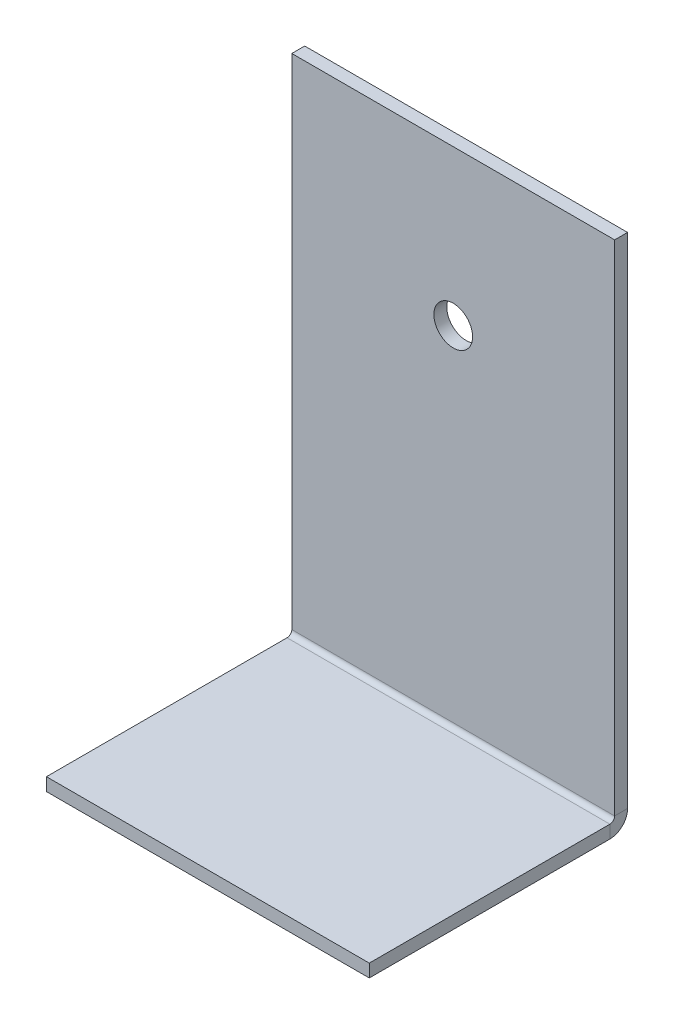
ISO-10303-21;
HEADER;
FILE_DESCRIPTION(('STEP AP214'),'2;1');
FILE_NAME('part.step','',(''),(''),'','','');
FILE_SCHEMA(('AUTOMOTIVE_DESIGN { 1 0 10303 214 1 1 1 1 }'));
ENDSEC;
DATA;
#1=APPLICATION_CONTEXT('core data for automotive mechanical design processes');
#2=APPLICATION_PROTOCOL_DEFINITION('international standard','automotive_design',2000,#1);
#3=PRODUCT_CONTEXT('',#1,'mechanical');
#4=PRODUCT('Part','Part','',(#3));
#5=PRODUCT_RELATED_PRODUCT_CATEGORY('part','',(#4));
#6=PRODUCT_DEFINITION_FORMATION('','',#4);
#7=PRODUCT_DEFINITION_CONTEXT('part definition',#1,'design');
#8=PRODUCT_DEFINITION('design','',#6,#7);
#9=PRODUCT_DEFINITION_SHAPE('','',#8);
#10=(LENGTH_UNIT() NAMED_UNIT(*) SI_UNIT(.MILLI.,.METRE.));
#11=(NAMED_UNIT(*) PLANE_ANGLE_UNIT() SI_UNIT($,.RADIAN.));
#12=(NAMED_UNIT(*) SI_UNIT($,.STERADIAN.) SOLID_ANGLE_UNIT());
#13=UNCERTAINTY_MEASURE_WITH_UNIT(LENGTH_MEASURE(1.E-05),#10,'distance_accuracy_value','');
#14=(GEOMETRIC_REPRESENTATION_CONTEXT(3) GLOBAL_UNCERTAINTY_ASSIGNED_CONTEXT((#13)) GLOBAL_UNIT_ASSIGNED_CONTEXT((#10,
#11,#12)) REPRESENTATION_CONTEXT('',''));
#15=CARTESIAN_POINT('',(0.,0.,0.));
#16=DIRECTION('',(0.,0.,1.));
#17=DIRECTION('',(1.,0.,0.));
#18=AXIS2_PLACEMENT_3D('',#15,#16,#17);
#19=CARTESIAN_POINT('',(-28.5511363636364,-2.,-17.6846590909091));
#20=DIRECTION('',(-1.,0.,0.));
#21=DIRECTION('',(0.,0.,1.));
#22=AXIS2_PLACEMENT_3D('',#19,#20,#21);
#23=PLANE('',#22);
#24=DIRECTION('',(0.,0.,1.));
#25=VECTOR('',#24,1.);
#26=CARTESIAN_POINT('',(-28.5511363636364,0.,-17.6846590909091));
#27=LINE('',#26,#25);
#28=CARTESIAN_POINT('',(-28.5511363636364,0.,-14.9480590909091));
#29=VERTEX_POINT('',#28);
#30=CARTESIAN_POINT('',(-28.5511363636364,0.,22.3153409090909));
#31=VERTEX_POINT('',#30);
#32=EDGE_CURVE('E105',#29,#31,#27,.T.);
#33=ORIENTED_EDGE('',*,*,#32,.F.);
#34=DIRECTION('',(0.,-1.,0.));
#35=VECTOR('',#34,1.);
#36=CARTESIAN_POINT('',(-28.5511363636364,0.,-14.9480590909091));
#37=LINE('',#36,#35);
#38=CARTESIAN_POINT('',(-28.5511363636364,-2.00000000000001,-14.9480590909091));
#39=VERTEX_POINT('',#38);
#40=EDGE_CURVE('E114',#29,#39,#37,.T.);
#41=ORIENTED_EDGE('',*,*,#40,.T.);
#42=DIRECTION('',(0.,0.,1.));
#43=VECTOR('',#42,1.);
#44=CARTESIAN_POINT('',(-28.5511363636364,-2.,-17.6846590909091));
#45=LINE('',#44,#43);
#46=CARTESIAN_POINT('',(-28.5511363636364,-2.,22.3153409090909));
#47=VERTEX_POINT('',#46);
#48=EDGE_CURVE('E102',#39,#47,#45,.T.);
#49=ORIENTED_EDGE('',*,*,#48,.T.);
#50=DIRECTION('',(0.,1.,0.));
#51=VECTOR('',#50,1.);
#52=CARTESIAN_POINT('',(-28.5511363636364,-2.,22.3153409090909));
#53=LINE('',#52,#51);
#54=EDGE_CURVE('E60',#47,#31,#53,.T.);
#55=ORIENTED_EDGE('',*,*,#54,.T.);
#56=EDGE_LOOP('',(#33,#41,#49,#55));
#57=FACE_BOUND('',#56,.T.);
#58=ADVANCED_FACE('F57',(#57),#23,.T.);
#59=CARTESIAN_POINT('',(0.,-2.,0.));
#60=DIRECTION('',(0.,1.,0.));
#61=DIRECTION('',(0.,0.,1.));
#62=AXIS2_PLACEMENT_3D('',#59,#60,#61);
#63=PLANE('',#62);
#64=DIRECTION('',(-1.,0.,0.));
#65=VECTOR('',#64,1.);
#66=CARTESIAN_POINT('',(-28.5511363636364,-2.00000000000001,-14.9480590909091));
#67=LINE('',#66,#65);
#68=CARTESIAN_POINT('',(21.4488636363636,-2.,-14.9480590909091));
#69=VERTEX_POINT('',#68);
#70=EDGE_CURVE('E130',#39,#69,#67,.F.);
#71=ORIENTED_EDGE('',*,*,#70,.T.);
#72=DIRECTION('',(0.,0.,-1.));
#73=VECTOR('',#72,1.);
#74=CARTESIAN_POINT('',(21.4488636363636,-2.,-17.6846590909091));
#75=LINE('',#74,#73);
#76=CARTESIAN_POINT('',(21.4488636363636,-2.,22.3153409090909));
#77=VERTEX_POINT('',#76);
#78=EDGE_CURVE('E110',#77,#69,#75,.T.);
#79=ORIENTED_EDGE('',*,*,#78,.F.);
#80=DIRECTION('',(1.,0.,0.));
#81=VECTOR('',#80,1.);
#82=CARTESIAN_POINT('',(-28.5511363636364,-2.,22.3153409090909));
#83=LINE('',#82,#81);
#84=EDGE_CURVE('E95',#47,#77,#83,.T.);
#85=ORIENTED_EDGE('',*,*,#84,.F.);
#86=ORIENTED_EDGE('',*,*,#48,.F.);
#87=EDGE_LOOP('',(#71,#79,#85,#86));
#88=FACE_BOUND('',#87,.T.);
#89=ADVANCED_FACE('F229',(#88),#63,.F.);
#90=CARTESIAN_POINT('',(0.,0.,0.));
#91=DIRECTION('',(0.,1.,0.));
#92=DIRECTION('',(0.,0.,1.));
#93=AXIS2_PLACEMENT_3D('',#90,#91,#92);
#94=PLANE('',#93);
#95=DIRECTION('',(0.,0.,-1.));
#96=VECTOR('',#95,1.);
#97=CARTESIAN_POINT('',(21.4488636363636,0.,-17.6846590909091));
#98=LINE('',#97,#96);
#99=CARTESIAN_POINT('',(21.4488636363636,0.,22.3153409090909));
#100=VERTEX_POINT('',#99);
#101=CARTESIAN_POINT('',(21.4488636363636,0.,-14.9480590909091));
#102=VERTEX_POINT('',#101);
#103=EDGE_CURVE('E97',#100,#102,#98,.T.);
#104=ORIENTED_EDGE('',*,*,#103,.T.);
#105=DIRECTION('',(-1.,0.,0.));
#106=VECTOR('',#105,1.);
#107=CARTESIAN_POINT('',(-28.5511363636364,0.,-14.9480590909091));
#108=LINE('',#107,#106);
#109=EDGE_CURVE('E71',#29,#102,#108,.F.);
#110=ORIENTED_EDGE('',*,*,#109,.F.);
#111=ORIENTED_EDGE('',*,*,#32,.T.);
#112=DIRECTION('',(1.,0.,0.));
#113=VECTOR('',#112,1.);
#114=CARTESIAN_POINT('',(-28.5511363636364,0.,22.3153409090909));
#115=LINE('',#114,#113);
#116=EDGE_CURVE('E93',#31,#100,#115,.T.);
#117=ORIENTED_EDGE('',*,*,#116,.T.);
#118=EDGE_LOOP('',(#104,#110,#111,#117));
#119=FACE_BOUND('',#118,.T.);
#120=ADVANCED_FACE('F104',(#119),#94,.T.);
#121=CARTESIAN_POINT('',(21.4488636363636,-2.,-17.6846590909091));
#122=DIRECTION('',(1.,0.,0.));
#123=DIRECTION('',(0.,0.,-1.));
#124=AXIS2_PLACEMENT_3D('',#121,#122,#123);
#125=PLANE('',#124);
#126=DIRECTION('',(0.,-1.,0.));
#127=VECTOR('',#126,1.);
#128=CARTESIAN_POINT('',(21.4488636363636,0.,-14.9480590909091));
#129=LINE('',#128,#127);
#130=EDGE_CURVE('E101',#102,#69,#129,.T.);
#131=ORIENTED_EDGE('',*,*,#130,.F.);
#132=ORIENTED_EDGE('',*,*,#103,.F.);
#133=DIRECTION('',(0.,1.,0.));
#134=VECTOR('',#133,1.);
#135=CARTESIAN_POINT('',(21.4488636363636,-2.,22.3153409090909));
#136=LINE('',#135,#134);
#137=EDGE_CURVE('E13',#77,#100,#136,.T.);
#138=ORIENTED_EDGE('',*,*,#137,.F.);
#139=ORIENTED_EDGE('',*,*,#78,.T.);
#140=EDGE_LOOP('',(#131,#132,#138,#139));
#141=FACE_BOUND('',#140,.T.);
#142=ADVANCED_FACE('F98',(#141),#125,.T.);
#143=CARTESIAN_POINT('',(-28.5511363636364,-2.,22.3153409090909));
#144=DIRECTION('',(0.,0.,1.));
#145=DIRECTION('',(1.,0.,0.));
#146=AXIS2_PLACEMENT_3D('',#143,#144,#145);
#147=PLANE('',#146);
#148=ORIENTED_EDGE('',*,*,#116,.F.);
#149=ORIENTED_EDGE('',*,*,#54,.F.);
#150=ORIENTED_EDGE('',*,*,#84,.T.);
#151=ORIENTED_EDGE('',*,*,#137,.T.);
#152=EDGE_LOOP('',(#148,#149,#150,#151));
#153=FACE_BOUND('',#152,.T.);
#154=ADVANCED_FACE('F90',(#153),#147,.T.);
#155=CARTESIAN_POINT('',(21.4488636363636,0.736599999999992,-14.9480590909091));
#156=DIRECTION('',(1.,0.,0.));
#157=DIRECTION('',(0.,0.,-1.));
#158=AXIS2_PLACEMENT_3D('',#155,#156,#157);
#159=PLANE('',#158);
#160=DIRECTION('',(0.,0.,1.));
#161=VECTOR('',#160,1.);
#162=CARTESIAN_POINT('',(21.4488636363636,0.736600000000011,-17.6846590909091));
#163=LINE('',#162,#161);
#164=CARTESIAN_POINT('',(21.4488636363636,0.736599999999989,-15.6846590909091));
#165=VERTEX_POINT('',#164);
#166=CARTESIAN_POINT('',(21.4488636363636,0.736599999999982,-17.6846590909091));
#167=VERTEX_POINT('',#166);
#168=EDGE_CURVE('E135',#165,#167,#163,.F.);
#169=ORIENTED_EDGE('',*,*,#168,.F.);
#170=CARTESIAN_POINT('',(21.4488636363636,0.736599999999992,-14.9480590909091));
#171=DIRECTION('',(-1.,0.,0.));
#172=DIRECTION('',(0.,0.,1.));
#173=AXIS2_PLACEMENT_3D('',#170,#171,#172);
#174=CIRCLE('',#173,0.7366);
#175=EDGE_CURVE('E124',#102,#165,#174,.F.);
#176=ORIENTED_EDGE('',*,*,#175,.F.);
#177=ORIENTED_EDGE('',*,*,#130,.T.);
#178=CARTESIAN_POINT('',(21.4488636363636,0.736599999999992,-14.9480590909091));
#179=DIRECTION('',(-1.,0.,0.));
#180=DIRECTION('',(0.,0.,1.));
#181=AXIS2_PLACEMENT_3D('',#178,#179,#180);
#182=CIRCLE('',#181,2.7366);
#183=EDGE_CURVE('E117',#69,#167,#182,.F.);
#184=ORIENTED_EDGE('',*,*,#183,.T.);
#185=EDGE_LOOP('',(#169,#176,#177,#184));
#186=FACE_BOUND('',#185,.T.);
#187=ADVANCED_FACE('F232',(#186),#159,.T.);
#188=CARTESIAN_POINT('',(-28.5511363636364,0.736599999999992,-14.9480590909091));
#189=DIRECTION('',(1.,0.,0.));
#190=DIRECTION('',(0.,0.,-1.));
#191=AXIS2_PLACEMENT_3D('',#188,#189,#190);
#192=PLANE('',#191);
#193=CARTESIAN_POINT('',(-28.5511363636364,0.736599999999992,-14.9480590909091));
#194=DIRECTION('',(-1.,0.,0.));
#195=DIRECTION('',(0.,0.,1.));
#196=AXIS2_PLACEMENT_3D('',#193,#194,#195);
#197=CIRCLE('',#196,0.7366);
#198=CARTESIAN_POINT('',(-28.5511363636364,0.736599999999989,-15.6846590909091));
#199=VERTEX_POINT('',#198);
#200=EDGE_CURVE('E119',#199,#29,#197,.T.);
#201=ORIENTED_EDGE('',*,*,#200,.F.);
#202=DIRECTION('',(0.,0.,1.));
#203=VECTOR('',#202,1.);
#204=CARTESIAN_POINT('',(-28.5511363636364,0.736599999999997,-15.6846590909091));
#205=LINE('',#204,#203);
#206=CARTESIAN_POINT('',(-28.5511363636364,0.736600000000011,-17.6846590909091));
#207=VERTEX_POINT('',#206);
#208=EDGE_CURVE('E142',#199,#207,#205,.F.);
#209=ORIENTED_EDGE('',*,*,#208,.T.);
#210=CARTESIAN_POINT('',(-28.5511363636364,0.736599999999992,-14.9480590909091));
#211=DIRECTION('',(-1.,0.,0.));
#212=DIRECTION('',(0.,0.,1.));
#213=AXIS2_PLACEMENT_3D('',#210,#211,#212);
#214=CIRCLE('',#213,2.7366);
#215=EDGE_CURVE('E127',#207,#39,#214,.T.);
#216=ORIENTED_EDGE('',*,*,#215,.T.);
#217=ORIENTED_EDGE('',*,*,#40,.F.);
#218=EDGE_LOOP('',(#201,#209,#216,#217));
#219=FACE_BOUND('',#218,.T.);
#220=ADVANCED_FACE('F236',(#219),#192,.F.);
#221=CARTESIAN_POINT('',(-28.5511363636364,0.736599999999992,-14.9480590909091));
#222=DIRECTION('',(-1.,0.,0.));
#223=DIRECTION('',(0.,0.,-1.));
#224=AXIS2_PLACEMENT_3D('',#221,#222,#223);
#225=CYLINDRICAL_SURFACE('',#224,2.7366);
#226=ORIENTED_EDGE('',*,*,#70,.F.);
#227=ORIENTED_EDGE('',*,*,#215,.F.);
#228=DIRECTION('',(-1.,0.,0.));
#229=VECTOR('',#228,1.);
#230=CARTESIAN_POINT('',(21.4488636363636,0.736600000000011,-17.6846590909091));
#231=LINE('',#230,#229);
#232=EDGE_CURVE('E145',#207,#167,#231,.F.);
#233=ORIENTED_EDGE('',*,*,#232,.T.);
#234=ORIENTED_EDGE('',*,*,#183,.F.);
#235=EDGE_LOOP('',(#226,#227,#233,#234));
#236=FACE_BOUND('',#235,.T.);
#237=ADVANCED_FACE('F233',(#236),#225,.T.);
#238=CARTESIAN_POINT('',(-28.5511363636364,0.736599999999992,-14.9480590909091));
#239=DIRECTION('',(-1.,0.,0.));
#240=DIRECTION('',(0.,0.,-1.));
#241=AXIS2_PLACEMENT_3D('',#238,#239,#240);
#242=CYLINDRICAL_SURFACE('',#241,0.7366);
#243=ORIENTED_EDGE('',*,*,#109,.T.);
#244=ORIENTED_EDGE('',*,*,#175,.T.);
#245=DIRECTION('',(-1.,0.,0.));
#246=VECTOR('',#245,1.);
#247=CARTESIAN_POINT('',(21.4488636363636,0.736599999999997,-15.6846590909091));
#248=LINE('',#247,#246);
#249=EDGE_CURVE('E138',#165,#199,#248,.T.);
#250=ORIENTED_EDGE('',*,*,#249,.T.);
#251=ORIENTED_EDGE('',*,*,#200,.T.);
#252=EDGE_LOOP('',(#243,#244,#250,#251));
#253=FACE_BOUND('',#252,.T.);
#254=ADVANCED_FACE('F235',(#253),#242,.F.);
#255=CARTESIAN_POINT('',(21.4488636363636,0.,-17.6846590909091));
#256=DIRECTION('',(-1.,0.,0.));
#257=DIRECTION('',(0.,0.,1.));
#258=AXIS2_PLACEMENT_3D('',#255,#256,#257);
#259=PLANE('',#258);
#260=ORIENTED_EDGE('',*,*,#168,.T.);
#261=DIRECTION('',(0.,-1.,0.));
#262=VECTOR('',#261,1.);
#263=CARTESIAN_POINT('',(21.4488636363636,0.,-17.6846590909091));
#264=LINE('',#263,#262);
#265=CARTESIAN_POINT('',(21.4488636363636,78.,-17.6846590909094));
#266=VERTEX_POINT('',#265);
#267=EDGE_CURVE('E157',#266,#167,#264,.T.);
#268=ORIENTED_EDGE('',*,*,#267,.F.);
#269=DIRECTION('',(0.,0.,1.));
#270=VECTOR('',#269,1.);
#271=CARTESIAN_POINT('',(21.4488636363636,78.,-17.6846590909094));
#272=LINE('',#271,#270);
#273=CARTESIAN_POINT('',(21.4488636363636,78.,-15.6846590909094));
#274=VERTEX_POINT('',#273);
#275=EDGE_CURVE('E166',#266,#274,#272,.T.);
#276=ORIENTED_EDGE('',*,*,#275,.T.);
#277=DIRECTION('',(0.,1.,0.));
#278=VECTOR('',#277,1.);
#279=CARTESIAN_POINT('',(21.4488636363636,0.,-15.6846590909091));
#280=LINE('',#279,#278);
#281=EDGE_CURVE('E148',#274,#165,#280,.F.);
#282=ORIENTED_EDGE('',*,*,#281,.T.);
#283=EDGE_LOOP('',(#260,#268,#276,#282));
#284=FACE_BOUND('',#283,.T.);
#285=ADVANCED_FACE('F242',(#284),#259,.F.);
#286=CARTESIAN_POINT('',(-28.5511363636364,78.,-17.6846590909094));
#287=DIRECTION('',(1.,0.,0.));
#288=DIRECTION('',(0.,0.,-1.));
#289=AXIS2_PLACEMENT_3D('',#286,#287,#288);
#290=PLANE('',#289);
#291=ORIENTED_EDGE('',*,*,#208,.F.);
#292=DIRECTION('',(0.,-1.,0.));
#293=VECTOR('',#292,1.);
#294=CARTESIAN_POINT('',(-28.5511363636364,78.,-15.6846590909094));
#295=LINE('',#294,#293);
#296=CARTESIAN_POINT('',(-28.5511363636364,78.,-15.6846590909094));
#297=VERTEX_POINT('',#296);
#298=EDGE_CURVE('E151',#199,#297,#295,.F.);
#299=ORIENTED_EDGE('',*,*,#298,.T.);
#300=DIRECTION('',(0.,0.,1.));
#301=VECTOR('',#300,1.);
#302=CARTESIAN_POINT('',(-28.5511363636364,78.,-17.6846590909094));
#303=LINE('',#302,#301);
#304=CARTESIAN_POINT('',(-28.5511363636364,78.,-17.6846590909094));
#305=VERTEX_POINT('',#304);
#306=EDGE_CURVE('E122',#305,#297,#303,.T.);
#307=ORIENTED_EDGE('',*,*,#306,.F.);
#308=DIRECTION('',(0.,1.,0.));
#309=VECTOR('',#308,1.);
#310=CARTESIAN_POINT('',(-28.5511363636364,0.,-17.6846590909091));
#311=LINE('',#310,#309);
#312=EDGE_CURVE('E160',#207,#305,#311,.T.);
#313=ORIENTED_EDGE('',*,*,#312,.F.);
#314=EDGE_LOOP('',(#291,#299,#307,#313));
#315=FACE_BOUND('',#314,.T.);
#316=ADVANCED_FACE('F190',(#315),#290,.F.);
#317=CARTESIAN_POINT('',(0.,0.,-17.6846590909091));
#318=DIRECTION('',(0.,0.,1.));
#319=DIRECTION('',(0.,-1.,0.));
#320=AXIS2_PLACEMENT_3D('',#317,#318,#319);
#321=PLANE('',#320);
#322=CARTESIAN_POINT('',(-3.55113636363637,54.,-17.6846590909093));
#323=DIRECTION('',(0.,0.,-1.));
#324=DIRECTION('',(0.,1.,0.));
#325=AXIS2_PLACEMENT_3D('',#322,#323,#324);
#326=CIRCLE('',#325,3.);
#327=CARTESIAN_POINT('',(-3.55113636363637,57.,-17.6846590909093));
#328=VERTEX_POINT('',#327);
#329=EDGE_CURVE('E139',#328,#328,#326,.T.);
#330=ORIENTED_EDGE('',*,*,#329,.F.);
#331=EDGE_LOOP('',(#330));
#332=FACE_BOUND('',#331,.T.);
#333=ORIENTED_EDGE('',*,*,#232,.F.);
#334=ORIENTED_EDGE('',*,*,#312,.T.);
#335=DIRECTION('',(1.,0.,0.));
#336=VECTOR('',#335,1.);
#337=CARTESIAN_POINT('',(0.,78.,-17.6846590909094));
#338=LINE('',#337,#336);
#339=EDGE_CURVE('E163',#305,#266,#338,.T.);
#340=ORIENTED_EDGE('',*,*,#339,.T.);
#341=ORIENTED_EDGE('',*,*,#267,.T.);
#342=EDGE_LOOP('',(#333,#334,#340,#341));
#343=FACE_BOUND('',#342,.T.);
#344=ADVANCED_FACE('F187',(#332,#343),#321,.F.);
#345=CARTESIAN_POINT('',(0.,0.,-15.6846590909091));
#346=DIRECTION('',(0.,0.,1.));
#347=DIRECTION('',(0.,-1.,0.));
#348=AXIS2_PLACEMENT_3D('',#345,#346,#347);
#349=PLANE('',#348);
#350=CARTESIAN_POINT('',(-3.55113636363637,54.,-15.6846590909093));
#351=DIRECTION('',(0.,0.,-1.));
#352=DIRECTION('',(0.,1.,0.));
#353=AXIS2_PLACEMENT_3D('',#350,#351,#352);
#354=CIRCLE('',#353,3.);
#355=CARTESIAN_POINT('',(-3.55113636363637,57.,-15.6846590909093));
#356=VERTEX_POINT('',#355);
#357=EDGE_CURVE('E173',#356,#356,#354,.T.);
#358=ORIENTED_EDGE('',*,*,#357,.T.);
#359=EDGE_LOOP('',(#358));
#360=FACE_BOUND('',#359,.T.);
#361=ORIENTED_EDGE('',*,*,#298,.F.);
#362=ORIENTED_EDGE('',*,*,#249,.F.);
#363=ORIENTED_EDGE('',*,*,#281,.F.);
#364=DIRECTION('',(-1.,0.,0.));
#365=VECTOR('',#364,1.);
#366=CARTESIAN_POINT('',(21.4488636363636,78.,-15.6846590909094));
#367=LINE('',#366,#365);
#368=EDGE_CURVE('E154',#297,#274,#367,.F.);
#369=ORIENTED_EDGE('',*,*,#368,.F.);
#370=EDGE_LOOP('',(#361,#362,#363,#369));
#371=FACE_BOUND('',#370,.T.);
#372=ADVANCED_FACE('F177',(#360,#371),#349,.T.);
#373=CARTESIAN_POINT('',(21.4488636363636,78.,-17.6846590909094));
#374=DIRECTION('',(0.,-1.,0.));
#375=DIRECTION('',(0.,0.,-1.));
#376=AXIS2_PLACEMENT_3D('',#373,#374,#375);
#377=PLANE('',#376);
#378=ORIENTED_EDGE('',*,*,#368,.T.);
#379=ORIENTED_EDGE('',*,*,#275,.F.);
#380=ORIENTED_EDGE('',*,*,#339,.F.);
#381=ORIENTED_EDGE('',*,*,#306,.T.);
#382=EDGE_LOOP('',(#378,#379,#380,#381));
#383=FACE_BOUND('',#382,.T.);
#384=ADVANCED_FACE('F183',(#383),#377,.F.);
#385=CARTESIAN_POINT('',(-3.55113636363637,54.,-17.6846590909093));
#386=DIRECTION('',(0.,0.,-1.));
#387=DIRECTION('',(0.,1.,0.));
#388=AXIS2_PLACEMENT_3D('',#385,#386,#387);
#389=CYLINDRICAL_SURFACE('',#388,3.);
#390=ORIENTED_EDGE('',*,*,#357,.F.);
#391=EDGE_LOOP('',(#390));
#392=FACE_BOUND('',#391,.T.);
#393=ORIENTED_EDGE('',*,*,#329,.T.);
#394=EDGE_LOOP('',(#393));
#395=FACE_BOUND('',#394,.T.);
#396=ADVANCED_FACE('F180',(#392,#395),#389,.F.);
#397=CLOSED_SHELL('',(#58,#89,#120,#142,#154,#187,#220,#237,#254,#285,#316,#344,#372,#384,#396));
#398=MANIFOLD_SOLID_BREP('B2',#397);
#399=ADVANCED_BREP_SHAPE_REPRESENTATION('',(#18,#398),#14);
#400=SHAPE_DEFINITION_REPRESENTATION(#9,#399);
ENDSEC;
END-ISO-10303-21;
